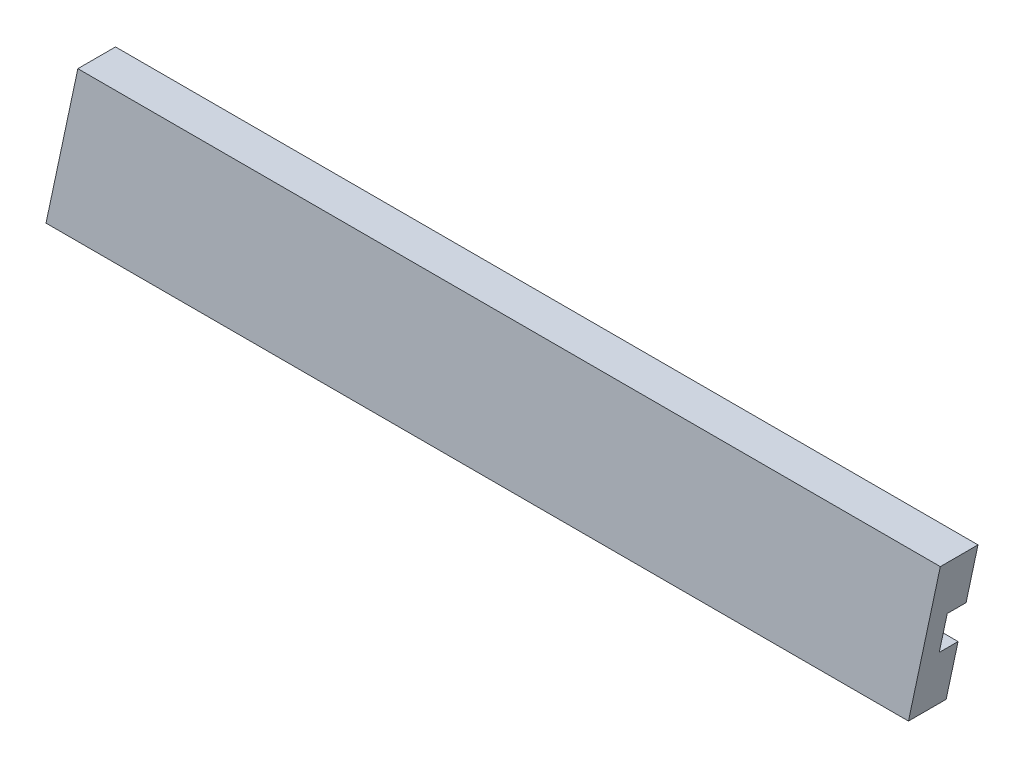
ISO-10303-21;
HEADER;
FILE_DESCRIPTION(('STEP AP214'),'2;1');
FILE_NAME('part.step','',(''),(''),'','','');
FILE_SCHEMA(('AUTOMOTIVE_DESIGN { 1 0 10303 214 1 1 1 1 }'));
ENDSEC;
DATA;
#1=APPLICATION_CONTEXT('core data for automotive mechanical design processes');
#2=APPLICATION_PROTOCOL_DEFINITION('international standard','automotive_design',2000,#1);
#3=PRODUCT_CONTEXT('',#1,'mechanical');
#4=PRODUCT('Part','Part','',(#3));
#5=PRODUCT_RELATED_PRODUCT_CATEGORY('part','',(#4));
#6=PRODUCT_DEFINITION_FORMATION('','',#4);
#7=PRODUCT_DEFINITION_CONTEXT('part definition',#1,'design');
#8=PRODUCT_DEFINITION('design','',#6,#7);
#9=PRODUCT_DEFINITION_SHAPE('','',#8);
#10=(LENGTH_UNIT() NAMED_UNIT(*) SI_UNIT(.MILLI.,.METRE.));
#11=(NAMED_UNIT(*) PLANE_ANGLE_UNIT() SI_UNIT($,.RADIAN.));
#12=(NAMED_UNIT(*) SI_UNIT($,.STERADIAN.) SOLID_ANGLE_UNIT());
#13=UNCERTAINTY_MEASURE_WITH_UNIT(LENGTH_MEASURE(1.E-05),#10,'distance_accuracy_value','');
#14=(GEOMETRIC_REPRESENTATION_CONTEXT(3) GLOBAL_UNCERTAINTY_ASSIGNED_CONTEXT((#13)) GLOBAL_UNIT_ASSIGNED_CONTEXT((#10,
#11,#12)) REPRESENTATION_CONTEXT('',''));
#15=CARTESIAN_POINT('',(0.,0.,0.));
#16=DIRECTION('',(0.,0.,1.));
#17=DIRECTION('',(1.,0.,0.));
#18=AXIS2_PLACEMENT_3D('',#15,#16,#17);
#19=CARTESIAN_POINT('',(0.,0.,87.3201638651491));
#20=DIRECTION('',(0.,0.,-1.));
#21=DIRECTION('',(-1.,0.,0.));
#22=AXIS2_PLACEMENT_3D('',#19,#20,#21);
#23=PLANE('',#22);
#24=DIRECTION('',(1.,0.,0.));
#25=VECTOR('',#24,1.);
#26=CARTESIAN_POINT('',(0.,20.2545142655372,87.3201638651491));
#27=LINE('',#26,#25);
#28=CARTESIAN_POINT('',(-0.940612959245031,20.2545142655372,87.3201638651491));
#29=VERTEX_POINT('',#28);
#30=CARTESIAN_POINT('',(21.9513723590588,20.2545142655372,87.3201638651491));
#31=VERTEX_POINT('',#30);
#32=EDGE_CURVE('E43',#29,#31,#27,.T.);
#33=ORIENTED_EDGE('',*,*,#32,.F.);
#34=DIRECTION('',(0.208071978479146,0.978113516812734,0.));
#35=VECTOR('',#34,1.);
#36=CARTESIAN_POINT('',(-1.46966850046114,17.7675077027577,87.3201638651491));
#37=LINE('',#36,#35);
#38=CARTESIAN_POINT('',(-0.624285260863739,21.7415208283166,87.3201638651491));
#39=VERTEX_POINT('',#38);
#40=EDGE_CURVE('E88',#29,#39,#37,.T.);
#41=ORIENTED_EDGE('',*,*,#40,.T.);
#42=DIRECTION('',(1.,0.,0.));
#43=VECTOR('',#42,1.);
#44=CARTESIAN_POINT('',(-0.624285260863739,21.7415208283166,87.3201638651491));
#45=LINE('',#44,#43);
#46=CARTESIAN_POINT('',(22.26770005744,21.7415208283166,87.3201638651491));
#47=VERTEX_POINT('',#46);
#48=EDGE_CURVE('E125',#39,#47,#45,.T.);
#49=ORIENTED_EDGE('',*,*,#48,.T.);
#50=DIRECTION('',(-0.208071978479146,-0.978113516812734,0.));
#51=VECTOR('',#50,1.);
#52=CARTESIAN_POINT('',(22.26770005744,21.7415208283166,87.3201638651491));
#53=LINE('',#52,#51);
#54=EDGE_CURVE('E132',#47,#31,#53,.T.);
#55=ORIENTED_EDGE('',*,*,#54,.T.);
#56=EDGE_LOOP('',(#33,#41,#49,#55));
#57=FACE_BOUND('',#56,.T.);
#58=ADVANCED_FACE('F35',(#57),#23,.T.);
#59=CARTESIAN_POINT('',(-1.46966850046114,17.7675077027577,87.3201638651491));
#60=DIRECTION('',(0.978113516812734,-0.208071978479146,0.));
#61=DIRECTION('',(0.208071978479146,0.978113516812734,0.));
#62=AXIS2_PLACEMENT_3D('',#59,#60,#61);
#63=PLANE('',#62);
#64=ORIENTED_EDGE('',*,*,#40,.F.);
#65=DIRECTION('',(0.,0.,1.));
#66=VECTOR('',#65,1.);
#67=CARTESIAN_POINT('',(-0.940612959245031,20.2545142655372,87.3201638651491));
#68=LINE('',#67,#66);
#69=CARTESIAN_POINT('',(-0.940612959245031,20.2545142655372,87.8201638651491));
#70=VERTEX_POINT('',#69);
#71=EDGE_CURVE('E157',#29,#70,#68,.T.);
#72=ORIENTED_EDGE('',*,*,#71,.T.);
#73=DIRECTION('',(0.208071978479146,0.978113516812734,0.));
#74=VECTOR('',#73,1.);
#75=CARTESIAN_POINT('',(-1.46966850046114,17.7675077027577,87.8201638651491));
#76=LINE('',#75,#74);
#77=CARTESIAN_POINT('',(-1.15334080207984,19.2545142655372,87.8201638651491));
#78=VERTEX_POINT('',#77);
#79=EDGE_CURVE('E121',#78,#70,#76,.T.);
#80=ORIENTED_EDGE('',*,*,#79,.F.);
#81=DIRECTION('',(0.,0.,-1.));
#82=VECTOR('',#81,1.);
#83=CARTESIAN_POINT('',(-1.15334080207985,19.2545142655372,87.3201638651491));
#84=LINE('',#83,#82);
#85=CARTESIAN_POINT('',(-1.15334080207985,19.2545142655372,87.3201638651491));
#86=VERTEX_POINT('',#85);
#87=EDGE_CURVE('E111',#78,#86,#84,.T.);
#88=ORIENTED_EDGE('',*,*,#87,.T.);
#89=CARTESIAN_POINT('',(-1.46966850046114,17.7675077027577,87.3201638651491));
#90=VERTEX_POINT('',#89);
#91=EDGE_CURVE('E119',#90,#86,#37,.T.);
#92=ORIENTED_EDGE('',*,*,#91,.F.);
#93=DIRECTION('',(0.,0.,1.));
#94=VECTOR('',#93,1.);
#95=CARTESIAN_POINT('',(-1.46966850046114,17.7675077027577,87.3201638651491));
#96=LINE('',#95,#94);
#97=CARTESIAN_POINT('',(-1.46966850046114,17.7675077027577,88.3201638651491));
#98=VERTEX_POINT('',#97);
#99=EDGE_CURVE('E136',#90,#98,#96,.T.);
#100=ORIENTED_EDGE('',*,*,#99,.T.);
#101=DIRECTION('',(0.208071978479146,0.978113516812734,0.));
#102=VECTOR('',#101,1.);
#103=CARTESIAN_POINT('',(-1.46966850046114,17.7675077027577,88.3201638651491));
#104=LINE('',#103,#102);
#105=CARTESIAN_POINT('',(-0.624285260863739,21.7415208283166,88.3201638651491));
#106=VERTEX_POINT('',#105);
#107=EDGE_CURVE('E137',#98,#106,#104,.T.);
#108=ORIENTED_EDGE('',*,*,#107,.T.);
#109=DIRECTION('',(0.,0.,1.));
#110=VECTOR('',#109,1.);
#111=CARTESIAN_POINT('',(-0.624285260863739,21.7415208283166,87.3201638651491));
#112=LINE('',#111,#110);
#113=EDGE_CURVE('E114',#39,#106,#112,.T.);
#114=ORIENTED_EDGE('',*,*,#113,.F.);
#115=EDGE_LOOP('',(#64,#72,#80,#88,#92,#100,#108,#114));
#116=FACE_BOUND('',#115,.T.);
#117=ADVANCED_FACE('F37',(#116),#63,.F.);
#118=CARTESIAN_POINT('',(-0.624285260863739,21.7415208283166,87.3201638651491));
#119=DIRECTION('',(0.,-1.,0.));
#120=DIRECTION('',(0.,0.,-1.));
#121=AXIS2_PLACEMENT_3D('',#118,#119,#120);
#122=PLANE('',#121);
#123=DIRECTION('',(1.,0.,0.));
#124=VECTOR('',#123,1.);
#125=CARTESIAN_POINT('',(-0.624285260863739,21.7415208283166,88.3201638651491));
#126=LINE('',#125,#124);
#127=CARTESIAN_POINT('',(22.26770005744,21.7415208283166,88.3201638651491));
#128=VERTEX_POINT('',#127);
#129=EDGE_CURVE('E140',#106,#128,#126,.T.);
#130=ORIENTED_EDGE('',*,*,#129,.T.);
#131=DIRECTION('',(0.,0.,1.));
#132=VECTOR('',#131,1.);
#133=CARTESIAN_POINT('',(22.26770005744,21.7415208283166,87.3201638651491));
#134=LINE('',#133,#132);
#135=EDGE_CURVE('E148',#47,#128,#134,.T.);
#136=ORIENTED_EDGE('',*,*,#135,.F.);
#137=ORIENTED_EDGE('',*,*,#48,.F.);
#138=ORIENTED_EDGE('',*,*,#113,.T.);
#139=EDGE_LOOP('',(#130,#136,#137,#138));
#140=FACE_BOUND('',#139,.T.);
#141=ADVANCED_FACE('F166',(#140),#122,.F.);
#142=CARTESIAN_POINT('',(22.26770005744,21.7415208283166,87.3201638651491));
#143=DIRECTION('',(-0.978113516812734,0.208071978479146,0.));
#144=DIRECTION('',(-0.208071978479146,-0.978113516812734,0.));
#145=AXIS2_PLACEMENT_3D('',#142,#143,#144);
#146=PLANE('',#145);
#147=DIRECTION('',(-0.208071978479146,-0.978113516812734,0.));
#148=VECTOR('',#147,1.);
#149=CARTESIAN_POINT('',(22.26770005744,21.7415208283166,87.8201638651491));
#150=LINE('',#149,#148);
#151=CARTESIAN_POINT('',(21.9513723590588,20.2545142655372,87.8201638651491));
#152=VERTEX_POINT('',#151);
#153=CARTESIAN_POINT('',(21.7386445162239,19.2545142655372,87.8201638651491));
#154=VERTEX_POINT('',#153);
#155=EDGE_CURVE('E11',#152,#154,#150,.T.);
#156=ORIENTED_EDGE('',*,*,#155,.F.);
#157=DIRECTION('',(0.,0.,-1.));
#158=VECTOR('',#157,1.);
#159=CARTESIAN_POINT('',(21.9513723590588,20.2545142655372,87.3201638651491));
#160=LINE('',#159,#158);
#161=EDGE_CURVE('E122',#152,#31,#160,.T.);
#162=ORIENTED_EDGE('',*,*,#161,.T.);
#163=ORIENTED_EDGE('',*,*,#54,.F.);
#164=ORIENTED_EDGE('',*,*,#135,.T.);
#165=DIRECTION('',(-0.208071978479146,-0.978113516812734,0.));
#166=VECTOR('',#165,1.);
#167=CARTESIAN_POINT('',(22.26770005744,21.7415208283166,88.3201638651491));
#168=LINE('',#167,#166);
#169=CARTESIAN_POINT('',(21.4223168178426,17.7675077027577,88.3201638651491));
#170=VERTEX_POINT('',#169);
#171=EDGE_CURVE('E142',#128,#170,#168,.T.);
#172=ORIENTED_EDGE('',*,*,#171,.T.);
#173=DIRECTION('',(0.,0.,1.));
#174=VECTOR('',#173,1.);
#175=CARTESIAN_POINT('',(21.4223168178426,17.7675077027577,87.3201638651491));
#176=LINE('',#175,#174);
#177=CARTESIAN_POINT('',(21.4223168178426,17.7675077027577,87.3201638651491));
#178=VERTEX_POINT('',#177);
#179=EDGE_CURVE('E146',#178,#170,#176,.T.);
#180=ORIENTED_EDGE('',*,*,#179,.F.);
#181=CARTESIAN_POINT('',(21.7386445162239,19.2545142655372,87.3201638651491));
#182=VERTEX_POINT('',#181);
#183=EDGE_CURVE('E127',#182,#178,#53,.T.);
#184=ORIENTED_EDGE('',*,*,#183,.F.);
#185=DIRECTION('',(0.,0.,1.));
#186=VECTOR('',#185,1.);
#187=CARTESIAN_POINT('',(21.7386445162239,19.2545142655372,87.3201638651491));
#188=LINE('',#187,#186);
#189=EDGE_CURVE('E50',#182,#154,#188,.T.);
#190=ORIENTED_EDGE('',*,*,#189,.T.);
#191=EDGE_LOOP('',(#156,#162,#163,#164,#172,#180,#184,#190));
#192=FACE_BOUND('',#191,.T.);
#193=ADVANCED_FACE('F161',(#192),#146,.F.);
#194=CARTESIAN_POINT('',(21.4223168178426,17.7675077027577,87.3201638651491));
#195=DIRECTION('',(0.,1.,0.));
#196=DIRECTION('',(0.,0.,1.));
#197=AXIS2_PLACEMENT_3D('',#194,#195,#196);
#198=PLANE('',#197);
#199=DIRECTION('',(-1.,0.,0.));
#200=VECTOR('',#199,1.);
#201=CARTESIAN_POINT('',(21.4223168178426,17.7675077027577,88.3201638651491));
#202=LINE('',#201,#200);
#203=EDGE_CURVE('E80',#170,#98,#202,.T.);
#204=ORIENTED_EDGE('',*,*,#203,.T.);
#205=ORIENTED_EDGE('',*,*,#99,.F.);
#206=DIRECTION('',(-1.,0.,0.));
#207=VECTOR('',#206,1.);
#208=CARTESIAN_POINT('',(21.4223168178426,17.7675077027577,87.3201638651491));
#209=LINE('',#208,#207);
#210=EDGE_CURVE('E59',#178,#90,#209,.T.);
#211=ORIENTED_EDGE('',*,*,#210,.F.);
#212=ORIENTED_EDGE('',*,*,#179,.T.);
#213=EDGE_LOOP('',(#204,#205,#211,#212));
#214=FACE_BOUND('',#213,.T.);
#215=ADVANCED_FACE('F172',(#214),#198,.F.);
#216=DIRECTION('',(-1.,0.,0.));
#217=VECTOR('',#216,1.);
#218=CARTESIAN_POINT('',(0.,19.2545142655372,87.3201638651491));
#219=LINE('',#218,#217);
#220=EDGE_CURVE('E108',#182,#86,#219,.T.);
#221=ORIENTED_EDGE('',*,*,#220,.F.);
#222=ORIENTED_EDGE('',*,*,#183,.T.);
#223=ORIENTED_EDGE('',*,*,#210,.T.);
#224=ORIENTED_EDGE('',*,*,#91,.T.);
#225=EDGE_LOOP('',(#221,#222,#223,#224));
#226=FACE_BOUND('',#225,.T.);
#227=ADVANCED_FACE('F124',(#226),#23,.T.);
#228=CARTESIAN_POINT('',(0.,0.,88.3201638651491));
#229=DIRECTION('',(0.,0.,-1.));
#230=DIRECTION('',(-1.,0.,0.));
#231=AXIS2_PLACEMENT_3D('',#228,#229,#230);
#232=PLANE('',#231);
#233=ORIENTED_EDGE('',*,*,#107,.F.);
#234=ORIENTED_EDGE('',*,*,#203,.F.);
#235=ORIENTED_EDGE('',*,*,#171,.F.);
#236=ORIENTED_EDGE('',*,*,#129,.F.);
#237=EDGE_LOOP('',(#233,#234,#235,#236));
#238=FACE_BOUND('',#237,.T.);
#239=ADVANCED_FACE('F171',(#238),#232,.F.);
#240=CARTESIAN_POINT('',(0.,0.,87.8201638651491));
#241=DIRECTION('',(0.,0.,-1.));
#242=DIRECTION('',(-1.,0.,0.));
#243=AXIS2_PLACEMENT_3D('',#240,#241,#242);
#244=PLANE('',#243);
#245=ORIENTED_EDGE('',*,*,#79,.T.);
#246=DIRECTION('',(1.,0.,0.));
#247=VECTOR('',#246,1.);
#248=CARTESIAN_POINT('',(22.031165997257,20.2545142655372,87.8201638651491));
#249=LINE('',#248,#247);
#250=EDGE_CURVE('E175',#70,#152,#249,.T.);
#251=ORIENTED_EDGE('',*,*,#250,.T.);
#252=ORIENTED_EDGE('',*,*,#155,.T.);
#253=DIRECTION('',(-1.,0.,0.));
#254=VECTOR('',#253,1.);
#255=CARTESIAN_POINT('',(21.8450084376413,19.2545142655372,87.8201638651491));
#256=LINE('',#255,#254);
#257=EDGE_CURVE('E173',#154,#78,#256,.T.);
#258=ORIENTED_EDGE('',*,*,#257,.T.);
#259=EDGE_LOOP('',(#245,#251,#252,#258));
#260=FACE_BOUND('',#259,.T.);
#261=ADVANCED_FACE('F179',(#260),#244,.T.);
#262=CARTESIAN_POINT('',(21.8450084376413,20.2545142655372,87.8201638651491));
#263=DIRECTION('',(0.,1.,0.));
#264=DIRECTION('',(0.,0.,1.));
#265=AXIS2_PLACEMENT_3D('',#262,#263,#264);
#266=PLANE('',#265);
#267=ORIENTED_EDGE('',*,*,#32,.T.);
#268=ORIENTED_EDGE('',*,*,#161,.F.);
#269=ORIENTED_EDGE('',*,*,#250,.F.);
#270=ORIENTED_EDGE('',*,*,#71,.F.);
#271=EDGE_LOOP('',(#267,#268,#269,#270));
#272=FACE_BOUND('',#271,.T.);
#273=ADVANCED_FACE('F154',(#272),#266,.F.);
#274=CARTESIAN_POINT('',(-1.04697688066244,19.2545142655372,87.8201638651491));
#275=DIRECTION('',(0.,-1.,0.));
#276=DIRECTION('',(0.,0.,-1.));
#277=AXIS2_PLACEMENT_3D('',#274,#275,#276);
#278=PLANE('',#277);
#279=ORIENTED_EDGE('',*,*,#257,.F.);
#280=ORIENTED_EDGE('',*,*,#189,.F.);
#281=ORIENTED_EDGE('',*,*,#220,.T.);
#282=ORIENTED_EDGE('',*,*,#87,.F.);
#283=EDGE_LOOP('',(#279,#280,#281,#282));
#284=FACE_BOUND('',#283,.T.);
#285=ADVANCED_FACE('F110',(#284),#278,.F.);
#286=CLOSED_SHELL('',(#58,#117,#141,#193,#215,#227,#239,#261,#273,#285));
#287=MANIFOLD_SOLID_BREP('B2',#286);
#288=ADVANCED_BREP_SHAPE_REPRESENTATION('',(#18,#287),#14);
#289=SHAPE_DEFINITION_REPRESENTATION(#9,#288);
ENDSEC;
END-ISO-10303-21;
